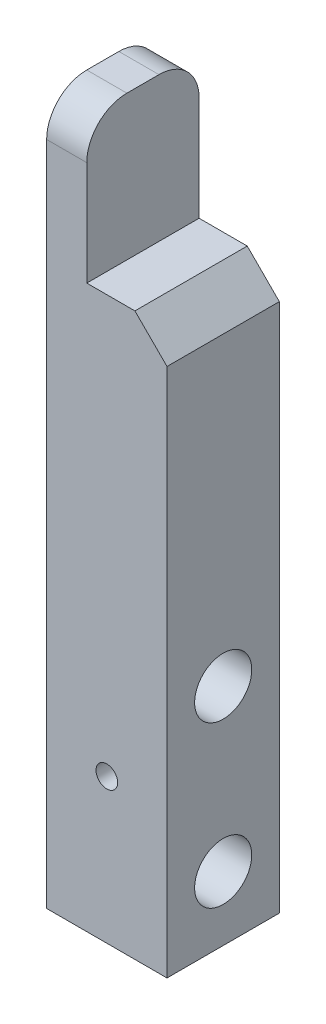
ISO-10303-21;
HEADER;
FILE_DESCRIPTION(('STEP AP214'),'2;1');
FILE_NAME('part.step','',(''),(''),'','','');
FILE_SCHEMA(('AUTOMOTIVE_DESIGN { 1 0 10303 214 1 1 1 1 }'));
ENDSEC;
DATA;
#1=APPLICATION_CONTEXT('core data for automotive mechanical design processes');
#2=APPLICATION_PROTOCOL_DEFINITION('international standard','automotive_design',2000,#1);
#3=PRODUCT_CONTEXT('',#1,'mechanical');
#4=PRODUCT('Part','Part','',(#3));
#5=PRODUCT_RELATED_PRODUCT_CATEGORY('part','',(#4));
#6=PRODUCT_DEFINITION_FORMATION('','',#4);
#7=PRODUCT_DEFINITION_CONTEXT('part definition',#1,'design');
#8=PRODUCT_DEFINITION('design','',#6,#7);
#9=PRODUCT_DEFINITION_SHAPE('','',#8);
#10=(LENGTH_UNIT() NAMED_UNIT(*) SI_UNIT(.MILLI.,.METRE.));
#11=(NAMED_UNIT(*) PLANE_ANGLE_UNIT() SI_UNIT($,.RADIAN.));
#12=(NAMED_UNIT(*) SI_UNIT($,.STERADIAN.) SOLID_ANGLE_UNIT());
#13=UNCERTAINTY_MEASURE_WITH_UNIT(LENGTH_MEASURE(1.E-05),#10,'distance_accuracy_value','');
#14=(GEOMETRIC_REPRESENTATION_CONTEXT(3) GLOBAL_UNCERTAINTY_ASSIGNED_CONTEXT((#13)) GLOBAL_UNIT_ASSIGNED_CONTEXT((#10,
#11,#12)) REPRESENTATION_CONTEXT('',''));
#15=CARTESIAN_POINT('',(0.,0.,0.));
#16=DIRECTION('',(0.,0.,1.));
#17=DIRECTION('',(1.,0.,0.));
#18=AXIS2_PLACEMENT_3D('',#15,#16,#17);
#19=CARTESIAN_POINT('',(-7.5,-18.,7.));
#20=DIRECTION('',(0.,1.,0.));
#21=DIRECTION('',(0.,0.,1.));
#22=AXIS2_PLACEMENT_3D('',#19,#20,#21);
#23=PLANE('',#22);
#24=DIRECTION('',(1.,0.,0.));
#25=VECTOR('',#24,1.);
#26=CARTESIAN_POINT('',(-7.5,-18.,-7.));
#27=LINE('',#26,#25);
#28=CARTESIAN_POINT('',(-7.5,-18.,-7.));
#29=VERTEX_POINT('',#28);
#30=CARTESIAN_POINT('',(7.5,-18.,-7.));
#31=VERTEX_POINT('',#30);
#32=EDGE_CURVE('E122',#29,#31,#27,.T.);
#33=ORIENTED_EDGE('',*,*,#32,.T.);
#34=DIRECTION('',(0.,0.,-1.));
#35=VECTOR('',#34,1.);
#36=CARTESIAN_POINT('',(7.5,-18.,7.));
#37=LINE('',#36,#35);
#38=CARTESIAN_POINT('',(7.5,-18.,7.));
#39=VERTEX_POINT('',#38);
#40=EDGE_CURVE('E106',#39,#31,#37,.T.);
#41=ORIENTED_EDGE('',*,*,#40,.F.);
#42=DIRECTION('',(1.,0.,0.));
#43=VECTOR('',#42,1.);
#44=CARTESIAN_POINT('',(-7.5,-18.,7.));
#45=LINE('',#44,#43);
#46=CARTESIAN_POINT('',(-7.5,-18.,7.));
#47=VERTEX_POINT('',#46);
#48=EDGE_CURVE('E111',#47,#39,#45,.T.);
#49=ORIENTED_EDGE('',*,*,#48,.F.);
#50=DIRECTION('',(0.,0.,-1.));
#51=VECTOR('',#50,1.);
#52=CARTESIAN_POINT('',(-7.5,-18.,7.));
#53=LINE('',#52,#51);
#54=EDGE_CURVE('E178',#47,#29,#53,.T.);
#55=ORIENTED_EDGE('',*,*,#54,.T.);
#56=EDGE_LOOP('',(#33,#41,#49,#55));
#57=FACE_BOUND('',#56,.T.);
#58=ADVANCED_FACE('F35',(#57),#23,.F.);
#59=CARTESIAN_POINT('',(7.5,23.,7.));
#60=DIRECTION('',(-1.,0.,0.));
#61=DIRECTION('',(0.,0.,1.));
#62=AXIS2_PLACEMENT_3D('',#59,#60,#61);
#63=PLANE('',#62);
#64=CARTESIAN_POINT('',(7.5,10.,0.));
#65=DIRECTION('',(1.,0.,0.));
#66=DIRECTION('',(0.,0.,-1.));
#67=AXIS2_PLACEMENT_3D('',#64,#65,#66);
#68=CIRCLE('',#67,3.56);
#69=CARTESIAN_POINT('',(7.5,10.,-3.56));
#70=VERTEX_POINT('',#69);
#71=EDGE_CURVE('E139',#70,#70,#68,.T.);
#72=ORIENTED_EDGE('',*,*,#71,.F.);
#73=EDGE_LOOP('',(#72));
#74=FACE_BOUND('',#73,.T.);
#75=CARTESIAN_POINT('',(7.5,-10.,0.));
#76=DIRECTION('',(1.,0.,0.));
#77=DIRECTION('',(0.,0.,-1.));
#78=AXIS2_PLACEMENT_3D('',#75,#76,#77);
#79=CIRCLE('',#78,3.56);
#80=CARTESIAN_POINT('',(7.5,-10.,-3.56));
#81=VERTEX_POINT('',#80);
#82=EDGE_CURVE('E136',#81,#81,#79,.T.);
#83=ORIENTED_EDGE('',*,*,#82,.F.);
#84=EDGE_LOOP('',(#83));
#85=FACE_BOUND('',#84,.T.);
#86=DIRECTION('',(0.,1.,0.));
#87=VECTOR('',#86,1.);
#88=CARTESIAN_POINT('',(7.5,23.,-7.));
#89=LINE('',#88,#87);
#90=CARTESIAN_POINT('',(7.5,47.9999999999999,-7.));
#91=VERTEX_POINT('',#90);
#92=EDGE_CURVE('E170',#31,#91,#89,.T.);
#93=ORIENTED_EDGE('',*,*,#92,.T.);
#94=DIRECTION('',(0.,0.,1.));
#95=VECTOR('',#94,1.);
#96=CARTESIAN_POINT('',(7.5,48.,7.));
#97=LINE('',#96,#95);
#98=CARTESIAN_POINT('',(7.5,47.9999999999999,7.));
#99=VERTEX_POINT('',#98);
#100=EDGE_CURVE('E43',#91,#99,#97,.T.);
#101=ORIENTED_EDGE('',*,*,#100,.T.);
#102=DIRECTION('',(0.,1.,0.));
#103=VECTOR('',#102,1.);
#104=CARTESIAN_POINT('',(7.5,-18.,7.));
#105=LINE('',#104,#103);
#106=EDGE_CURVE('E102',#39,#99,#105,.T.);
#107=ORIENTED_EDGE('',*,*,#106,.F.);
#108=ORIENTED_EDGE('',*,*,#40,.T.);
#109=EDGE_LOOP('',(#93,#101,#107,#108));
#110=FACE_BOUND('',#109,.T.);
#111=ADVANCED_FACE('F104',(#74,#85,#110),#63,.F.);
#112=CARTESIAN_POINT('',(-2.5,52.,7.));
#113=DIRECTION('',(0.,1.,0.));
#114=DIRECTION('',(0.,0.,1.));
#115=AXIS2_PLACEMENT_3D('',#112,#113,#114);
#116=PLANE('',#115);
#117=DIRECTION('',(1.,0.,0.));
#118=VECTOR('',#117,1.);
#119=CARTESIAN_POINT('',(-2.5,52.,7.));
#120=LINE('',#119,#118);
#121=CARTESIAN_POINT('',(-2.5,52.,7.));
#122=VERTEX_POINT('',#121);
#123=CARTESIAN_POINT('',(3.49999999999997,52.,7.));
#124=VERTEX_POINT('',#123);
#125=EDGE_CURVE('E110',#122,#124,#120,.T.);
#126=ORIENTED_EDGE('',*,*,#125,.T.);
#127=DIRECTION('',(0.,0.,-1.));
#128=VECTOR('',#127,1.);
#129=CARTESIAN_POINT('',(3.49999999999997,52.,-7.));
#130=LINE('',#129,#128);
#131=CARTESIAN_POINT('',(3.49999999999997,52.,-7.));
#132=VERTEX_POINT('',#131);
#133=EDGE_CURVE('E155',#124,#132,#130,.T.);
#134=ORIENTED_EDGE('',*,*,#133,.T.);
#135=DIRECTION('',(1.,0.,0.));
#136=VECTOR('',#135,1.);
#137=CARTESIAN_POINT('',(-2.5,52.,-7.));
#138=LINE('',#137,#136);
#139=CARTESIAN_POINT('',(-2.5,52.,-7.));
#140=VERTEX_POINT('',#139);
#141=EDGE_CURVE('E163',#140,#132,#138,.T.);
#142=ORIENTED_EDGE('',*,*,#141,.F.);
#143=DIRECTION('',(0.,0.,-1.));
#144=VECTOR('',#143,1.);
#145=CARTESIAN_POINT('',(-2.5,52.,7.));
#146=LINE('',#145,#144);
#147=EDGE_CURVE('E124',#122,#140,#146,.T.);
#148=ORIENTED_EDGE('',*,*,#147,.F.);
#149=EDGE_LOOP('',(#126,#134,#142,#148));
#150=FACE_BOUND('',#149,.T.);
#151=ADVANCED_FACE('F162',(#150),#116,.T.);
#152=CARTESIAN_POINT('',(-2.5,52.,7.));
#153=DIRECTION('',(-1.,0.,0.));
#154=DIRECTION('',(0.,0.,1.));
#155=AXIS2_PLACEMENT_3D('',#152,#153,#154);
#156=PLANE('',#155);
#157=DIRECTION('',(0.,1.,0.));
#158=VECTOR('',#157,1.);
#159=CARTESIAN_POINT('',(-2.5,52.,-7.));
#160=LINE('',#159,#158);
#161=CARTESIAN_POINT('',(-2.5,65.,-7.));
#162=VERTEX_POINT('',#161);
#163=EDGE_CURVE('E169',#140,#162,#160,.T.);
#164=ORIENTED_EDGE('',*,*,#163,.T.);
#165=CARTESIAN_POINT('',(-2.5,65.,-2.));
#166=DIRECTION('',(-1.,0.,0.));
#167=DIRECTION('',(0.,0.,1.));
#168=AXIS2_PLACEMENT_3D('',#165,#166,#167);
#169=CIRCLE('',#168,5.);
#170=CARTESIAN_POINT('',(-2.5,70.,-2.));
#171=VERTEX_POINT('',#170);
#172=EDGE_CURVE('E142',#162,#171,#169,.F.);
#173=ORIENTED_EDGE('',*,*,#172,.T.);
#174=DIRECTION('',(0.,0.,-1.));
#175=VECTOR('',#174,1.);
#176=CARTESIAN_POINT('',(-2.5,70.,7.));
#177=LINE('',#176,#175);
#178=CARTESIAN_POINT('',(-2.5,70.,2.));
#179=VERTEX_POINT('',#178);
#180=EDGE_CURVE('E129',#179,#171,#177,.T.);
#181=ORIENTED_EDGE('',*,*,#180,.F.);
#182=CARTESIAN_POINT('',(-2.5,65.,2.));
#183=DIRECTION('',(-1.,0.,0.));
#184=DIRECTION('',(0.,0.,1.));
#185=AXIS2_PLACEMENT_3D('',#182,#183,#184);
#186=CIRCLE('',#185,5.);
#187=CARTESIAN_POINT('',(-2.5,65.,7.));
#188=VERTEX_POINT('',#187);
#189=EDGE_CURVE('E127',#179,#188,#186,.F.);
#190=ORIENTED_EDGE('',*,*,#189,.T.);
#191=DIRECTION('',(0.,1.,0.));
#192=VECTOR('',#191,1.);
#193=CARTESIAN_POINT('',(-2.5,52.,7.));
#194=LINE('',#193,#192);
#195=EDGE_CURVE('E199',#122,#188,#194,.T.);
#196=ORIENTED_EDGE('',*,*,#195,.F.);
#197=ORIENTED_EDGE('',*,*,#147,.T.);
#198=EDGE_LOOP('',(#164,#173,#181,#190,#196,#197));
#199=FACE_BOUND('',#198,.T.);
#200=ADVANCED_FACE('F254',(#199),#156,.F.);
#201=CARTESIAN_POINT('',(-7.5,70.,7.));
#202=DIRECTION('',(0.,1.,0.));
#203=DIRECTION('',(0.,0.,1.));
#204=AXIS2_PLACEMENT_3D('',#201,#202,#203);
#205=PLANE('',#204);
#206=ORIENTED_EDGE('',*,*,#180,.T.);
#207=DIRECTION('',(1.,0.,0.));
#208=VECTOR('',#207,1.);
#209=CARTESIAN_POINT('',(-7.5,70.,-2.));
#210=LINE('',#209,#208);
#211=CARTESIAN_POINT('',(-7.5,70.,-2.));
#212=VERTEX_POINT('',#211);
#213=EDGE_CURVE('E147',#171,#212,#210,.F.);
#214=ORIENTED_EDGE('',*,*,#213,.T.);
#215=DIRECTION('',(0.,0.,-1.));
#216=VECTOR('',#215,1.);
#217=CARTESIAN_POINT('',(-7.5,70.,7.));
#218=LINE('',#217,#216);
#219=CARTESIAN_POINT('',(-7.5,70.,2.));
#220=VERTEX_POINT('',#219);
#221=EDGE_CURVE('E180',#220,#212,#218,.T.);
#222=ORIENTED_EDGE('',*,*,#221,.F.);
#223=DIRECTION('',(1.,0.,0.));
#224=VECTOR('',#223,1.);
#225=CARTESIAN_POINT('',(-7.5,70.,2.));
#226=LINE('',#225,#224);
#227=EDGE_CURVE('E144',#220,#179,#226,.T.);
#228=ORIENTED_EDGE('',*,*,#227,.T.);
#229=EDGE_LOOP('',(#206,#214,#222,#228));
#230=FACE_BOUND('',#229,.T.);
#231=ADVANCED_FACE('F186',(#230),#205,.T.);
#232=CARTESIAN_POINT('',(-7.5,-18.,7.));
#233=DIRECTION('',(-1.,0.,0.));
#234=DIRECTION('',(0.,0.,1.));
#235=AXIS2_PLACEMENT_3D('',#232,#233,#234);
#236=PLANE('',#235);
#237=CARTESIAN_POINT('',(-7.5,10.,0.));
#238=DIRECTION('',(-1.,0.,0.));
#239=DIRECTION('',(0.,0.,1.));
#240=AXIS2_PLACEMENT_3D('',#237,#238,#239);
#241=CIRCLE('',#240,3.56);
#242=CARTESIAN_POINT('',(-7.5,10.,3.56));
#243=VERTEX_POINT('',#242);
#244=EDGE_CURVE('E137',#243,#243,#241,.T.);
#245=ORIENTED_EDGE('',*,*,#244,.F.);
#246=EDGE_LOOP('',(#245));
#247=FACE_BOUND('',#246,.T.);
#248=CARTESIAN_POINT('',(-7.5,-10.,0.));
#249=DIRECTION('',(-1.,0.,0.));
#250=DIRECTION('',(0.,0.,1.));
#251=AXIS2_PLACEMENT_3D('',#248,#249,#250);
#252=CIRCLE('',#251,3.56);
#253=CARTESIAN_POINT('',(-7.5,-10.,3.56));
#254=VERTEX_POINT('',#253);
#255=EDGE_CURVE('E133',#254,#254,#252,.T.);
#256=ORIENTED_EDGE('',*,*,#255,.F.);
#257=EDGE_LOOP('',(#256));
#258=FACE_BOUND('',#257,.T.);
#259=ORIENTED_EDGE('',*,*,#221,.T.);
#260=CARTESIAN_POINT('',(-7.5,65.,-2.));
#261=DIRECTION('',(-1.,0.,0.));
#262=DIRECTION('',(0.,0.,1.));
#263=AXIS2_PLACEMENT_3D('',#260,#261,#262);
#264=CIRCLE('',#263,5.);
#265=CARTESIAN_POINT('',(-7.5,65.,-7.));
#266=VERTEX_POINT('',#265);
#267=EDGE_CURVE('E151',#212,#266,#264,.T.);
#268=ORIENTED_EDGE('',*,*,#267,.T.);
#269=DIRECTION('',(0.,1.,0.));
#270=VECTOR('',#269,1.);
#271=CARTESIAN_POINT('',(-7.5,-18.,-7.));
#272=LINE('',#271,#270);
#273=EDGE_CURVE('E119',#29,#266,#272,.T.);
#274=ORIENTED_EDGE('',*,*,#273,.F.);
#275=ORIENTED_EDGE('',*,*,#54,.F.);
#276=DIRECTION('',(0.,1.,0.));
#277=VECTOR('',#276,1.);
#278=CARTESIAN_POINT('',(-7.5,52.,7.));
#279=LINE('',#278,#277);
#280=CARTESIAN_POINT('',(-7.5,65.,7.));
#281=VERTEX_POINT('',#280);
#282=EDGE_CURVE('E116',#47,#281,#279,.T.);
#283=ORIENTED_EDGE('',*,*,#282,.T.);
#284=CARTESIAN_POINT('',(-7.5,65.,2.));
#285=DIRECTION('',(-1.,0.,0.));
#286=DIRECTION('',(0.,0.,1.));
#287=AXIS2_PLACEMENT_3D('',#284,#285,#286);
#288=CIRCLE('',#287,5.);
#289=EDGE_CURVE('E149',#281,#220,#288,.T.);
#290=ORIENTED_EDGE('',*,*,#289,.T.);
#291=EDGE_LOOP('',(#259,#268,#274,#275,#283,#290));
#292=FACE_BOUND('',#291,.T.);
#293=ADVANCED_FACE('F196',(#247,#258,#292),#236,.T.);
#294=CARTESIAN_POINT('',(0.,0.,7.));
#295=DIRECTION('',(0.,0.,1.));
#296=DIRECTION('',(1.,0.,0.));
#297=AXIS2_PLACEMENT_3D('',#294,#295,#296);
#298=PLANE('',#297);
#299=CARTESIAN_POINT('',(0.,0.,7.));
#300=DIRECTION('',(0.,0.,1.));
#301=DIRECTION('',(1.,0.,0.));
#302=AXIS2_PLACEMENT_3D('',#299,#300,#301);
#303=CIRCLE('',#302,1.35);
#304=CARTESIAN_POINT('',(1.35,0.,7.));
#305=VERTEX_POINT('',#304);
#306=EDGE_CURVE('E208',#305,#305,#303,.T.);
#307=ORIENTED_EDGE('',*,*,#306,.F.);
#308=EDGE_LOOP('',(#307));
#309=FACE_BOUND('',#308,.T.);
#310=ORIENTED_EDGE('',*,*,#106,.T.);
#311=DIRECTION('',(-0.707106781186546,0.707106781186549,0.));
#312=VECTOR('',#311,1.);
#313=CARTESIAN_POINT('',(27.75,27.7499999999999,7.));
#314=LINE('',#313,#312);
#315=EDGE_CURVE('E11',#99,#124,#314,.T.);
#316=ORIENTED_EDGE('',*,*,#315,.T.);
#317=ORIENTED_EDGE('',*,*,#125,.F.);
#318=ORIENTED_EDGE('',*,*,#195,.T.);
#319=DIRECTION('',(1.,0.,0.));
#320=VECTOR('',#319,1.);
#321=CARTESIAN_POINT('',(0.,65.,7.));
#322=LINE('',#321,#320);
#323=EDGE_CURVE('E153',#188,#281,#322,.F.);
#324=ORIENTED_EDGE('',*,*,#323,.T.);
#325=ORIENTED_EDGE('',*,*,#282,.F.);
#326=ORIENTED_EDGE('',*,*,#48,.T.);
#327=EDGE_LOOP('',(#310,#316,#317,#318,#324,#325,#326));
#328=FACE_BOUND('',#327,.T.);
#329=ADVANCED_FACE('F114',(#309,#328),#298,.T.);
#330=CARTESIAN_POINT('',(0.,0.,-7.));
#331=DIRECTION('',(0.,0.,1.));
#332=DIRECTION('',(1.,0.,0.));
#333=AXIS2_PLACEMENT_3D('',#330,#331,#332);
#334=PLANE('',#333);
#335=CARTESIAN_POINT('',(0.,0.,-7.));
#336=DIRECTION('',(0.,0.,1.));
#337=DIRECTION('',(1.,0.,0.));
#338=AXIS2_PLACEMENT_3D('',#335,#336,#337);
#339=CIRCLE('',#338,1.35);
#340=CARTESIAN_POINT('',(1.35,0.,-7.));
#341=VERTEX_POINT('',#340);
#342=EDGE_CURVE('E207',#341,#341,#339,.T.);
#343=ORIENTED_EDGE('',*,*,#342,.T.);
#344=EDGE_LOOP('',(#343));
#345=FACE_BOUND('',#344,.T.);
#346=ORIENTED_EDGE('',*,*,#141,.T.);
#347=DIRECTION('',(0.707106781186546,-0.707106781186549,0.));
#348=VECTOR('',#347,1.);
#349=CARTESIAN_POINT('',(3.49999999999997,52.,-7.));
#350=LINE('',#349,#348);
#351=EDGE_CURVE('E57',#132,#91,#350,.T.);
#352=ORIENTED_EDGE('',*,*,#351,.T.);
#353=ORIENTED_EDGE('',*,*,#92,.F.);
#354=ORIENTED_EDGE('',*,*,#32,.F.);
#355=ORIENTED_EDGE('',*,*,#273,.T.);
#356=DIRECTION('',(1.,0.,0.));
#357=VECTOR('',#356,1.);
#358=CARTESIAN_POINT('',(-2.5,65.,-7.));
#359=LINE('',#358,#357);
#360=EDGE_CURVE('E123',#266,#162,#359,.T.);
#361=ORIENTED_EDGE('',*,*,#360,.T.);
#362=ORIENTED_EDGE('',*,*,#163,.F.);
#363=EDGE_LOOP('',(#346,#352,#353,#354,#355,#361,#362));
#364=FACE_BOUND('',#363,.T.);
#365=ADVANCED_FACE('F167',(#345,#364),#334,.F.);
#366=CARTESIAN_POINT('',(-12.5,-10.,0.));
#367=DIRECTION('',(1.,0.,0.));
#368=DIRECTION('',(0.,0.,-1.));
#369=AXIS2_PLACEMENT_3D('',#366,#367,#368);
#370=CYLINDRICAL_SURFACE('',#369,3.56);
#371=ORIENTED_EDGE('',*,*,#255,.T.);
#372=EDGE_LOOP('',(#371));
#373=FACE_BOUND('',#372,.T.);
#374=ORIENTED_EDGE('',*,*,#82,.T.);
#375=EDGE_LOOP('',(#374));
#376=FACE_BOUND('',#375,.T.);
#377=ADVANCED_FACE('F228',(#373,#376),#370,.F.);
#378=CARTESIAN_POINT('',(-12.5,10.,0.));
#379=DIRECTION('',(1.,0.,0.));
#380=DIRECTION('',(0.,0.,-1.));
#381=AXIS2_PLACEMENT_3D('',#378,#379,#380);
#382=CYLINDRICAL_SURFACE('',#381,3.56);
#383=ORIENTED_EDGE('',*,*,#244,.T.);
#384=EDGE_LOOP('',(#383));
#385=FACE_BOUND('',#384,.T.);
#386=ORIENTED_EDGE('',*,*,#71,.T.);
#387=EDGE_LOOP('',(#386));
#388=FACE_BOUND('',#387,.T.);
#389=ADVANCED_FACE('F218',(#385,#388),#382,.F.);
#390=CARTESIAN_POINT('',(0.,0.,-7.));
#391=DIRECTION('',(0.,0.,1.));
#392=DIRECTION('',(1.,0.,0.));
#393=AXIS2_PLACEMENT_3D('',#390,#391,#392);
#394=CYLINDRICAL_SURFACE('',#393,1.35);
#395=ORIENTED_EDGE('',*,*,#342,.F.);
#396=EDGE_LOOP('',(#395));
#397=FACE_BOUND('',#396,.T.);
#398=ORIENTED_EDGE('',*,*,#306,.T.);
#399=EDGE_LOOP('',(#398));
#400=FACE_BOUND('',#399,.T.);
#401=ADVANCED_FACE('F215',(#397,#400),#394,.F.);
#402=CARTESIAN_POINT('',(0.,65.,-2.));
#403=DIRECTION('',(-1.,0.,0.));
#404=DIRECTION('',(0.,0.,1.));
#405=AXIS2_PLACEMENT_3D('',#402,#403,#404);
#406=CYLINDRICAL_SURFACE('',#405,5.);
#407=ORIENTED_EDGE('',*,*,#267,.F.);
#408=ORIENTED_EDGE('',*,*,#213,.F.);
#409=ORIENTED_EDGE('',*,*,#172,.F.);
#410=ORIENTED_EDGE('',*,*,#360,.F.);
#411=EDGE_LOOP('',(#407,#408,#409,#410));
#412=FACE_BOUND('',#411,.T.);
#413=ADVANCED_FACE('F192',(#412),#406,.T.);
#414=CARTESIAN_POINT('',(-7.5,65.,2.));
#415=DIRECTION('',(1.,0.,0.));
#416=DIRECTION('',(0.,0.,-1.));
#417=AXIS2_PLACEMENT_3D('',#414,#415,#416);
#418=CYLINDRICAL_SURFACE('',#417,5.);
#419=ORIENTED_EDGE('',*,*,#289,.F.);
#420=ORIENTED_EDGE('',*,*,#323,.F.);
#421=ORIENTED_EDGE('',*,*,#189,.F.);
#422=ORIENTED_EDGE('',*,*,#227,.F.);
#423=EDGE_LOOP('',(#419,#420,#421,#422));
#424=FACE_BOUND('',#423,.T.);
#425=ADVANCED_FACE('F245',(#424),#418,.T.);
#426=CARTESIAN_POINT('',(3.49999999999997,52.,7.));
#427=DIRECTION('',(0.707106781186549,0.707106781186546,0.));
#428=DIRECTION('',(0.,0.,1.));
#429=AXIS2_PLACEMENT_3D('',#426,#427,#428);
#430=PLANE('',#429);
#431=ORIENTED_EDGE('',*,*,#315,.F.);
#432=ORIENTED_EDGE('',*,*,#100,.F.);
#433=ORIENTED_EDGE('',*,*,#351,.F.);
#434=ORIENTED_EDGE('',*,*,#133,.F.);
#435=EDGE_LOOP('',(#431,#432,#433,#434));
#436=FACE_BOUND('',#435,.T.);
#437=ADVANCED_FACE('F37',(#436),#430,.T.);
#438=CLOSED_SHELL('',(#58,#111,#151,#200,#231,#293,#329,#365,#377,#389,#401,#413,#425,#437));
#439=MANIFOLD_SOLID_BREP('B2',#438);
#440=ADVANCED_BREP_SHAPE_REPRESENTATION('',(#18,#439),#14);
#441=SHAPE_DEFINITION_REPRESENTATION(#9,#440);
ENDSEC;
END-ISO-10303-21;
